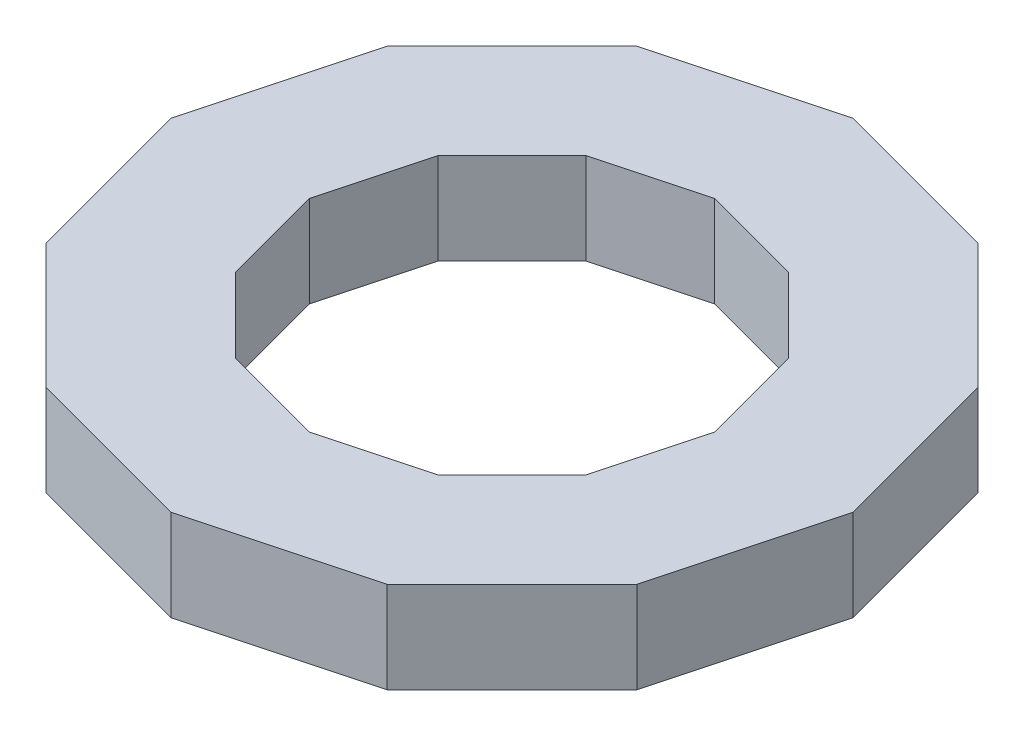
ISO-10303-21;
HEADER;
FILE_DESCRIPTION(('STEP AP214'),'2;1');
FILE_NAME('part.step','',(''),(''),'','','');
FILE_SCHEMA(('AUTOMOTIVE_DESIGN { 1 0 10303 214 1 1 1 1 }'));
ENDSEC;
DATA;
#1=APPLICATION_CONTEXT('core data for automotive mechanical design processes');
#2=APPLICATION_PROTOCOL_DEFINITION('international standard','automotive_design',2000,#1);
#3=PRODUCT_CONTEXT('',#1,'mechanical');
#4=PRODUCT('Part','Part','',(#3));
#5=PRODUCT_RELATED_PRODUCT_CATEGORY('part','',(#4));
#6=PRODUCT_DEFINITION_FORMATION('','',#4);
#7=PRODUCT_DEFINITION_CONTEXT('part definition',#1,'design');
#8=PRODUCT_DEFINITION('design','',#6,#7);
#9=PRODUCT_DEFINITION_SHAPE('','',#8);
#10=(LENGTH_UNIT() NAMED_UNIT(*) SI_UNIT(.MILLI.,.METRE.));
#11=(NAMED_UNIT(*) PLANE_ANGLE_UNIT() SI_UNIT($,.RADIAN.));
#12=(NAMED_UNIT(*) SI_UNIT($,.STERADIAN.) SOLID_ANGLE_UNIT());
#13=UNCERTAINTY_MEASURE_WITH_UNIT(LENGTH_MEASURE(1.E-05),#10,'distance_accuracy_value','');
#14=(GEOMETRIC_REPRESENTATION_CONTEXT(3) GLOBAL_UNCERTAINTY_ASSIGNED_CONTEXT((#13)) GLOBAL_UNIT_ASSIGNED_CONTEXT((#10,
#11,#12)) REPRESENTATION_CONTEXT('',''));
#15=CARTESIAN_POINT('',(0.,0.,0.));
#16=DIRECTION('',(0.,0.,1.));
#17=DIRECTION('',(1.,0.,0.));
#18=AXIS2_PLACEMENT_3D('',#15,#16,#17);
#19=CARTESIAN_POINT('',(0.,19.05,0.));
#20=DIRECTION('',(0.,1.,0.));
#21=DIRECTION('',(0.,0.,1.));
#22=AXIS2_PLACEMENT_3D('',#19,#20,#21);
#23=PLANE('',#22);
#24=DIRECTION('',(0.258819045102521,0.,-0.965925826289068));
#25=VECTOR('',#24,1.);
#26=CARTESIAN_POINT('',(61.6177909333269,19.05,35.5750481822264));
#27=LINE('',#26,#25);
#28=CARTESIAN_POINT('',(61.6177909333269,19.05,35.5750481822264));
#29=VERTEX_POINT('',#28);
#30=CARTESIAN_POINT('',(71.1500963644527,19.05,0.));
#31=VERTEX_POINT('',#30);
#32=EDGE_CURVE('E298',#29,#31,#27,.T.);
#33=ORIENTED_EDGE('',*,*,#32,.T.);
#34=DIRECTION('',(-0.258819045102521,0.,-0.965925826289068));
#35=VECTOR('',#34,1.);
#36=CARTESIAN_POINT('',(71.1500963644527,19.05,0.));
#37=LINE('',#36,#35);
#38=CARTESIAN_POINT('',(61.6177909333269,19.05,-35.5750481822263));
#39=VERTEX_POINT('',#38);
#40=EDGE_CURVE('E302',#31,#39,#37,.T.);
#41=ORIENTED_EDGE('',*,*,#40,.T.);
#42=DIRECTION('',(-0.707106781186548,0.,-0.707106781186547));
#43=VECTOR('',#42,1.);
#44=CARTESIAN_POINT('',(61.6177909333269,19.05,-35.5750481822263));
#45=LINE('',#44,#43);
#46=CARTESIAN_POINT('',(35.5750481822263,19.05,-61.6177909333269));
#47=VERTEX_POINT('',#46);
#48=EDGE_CURVE('E306',#39,#47,#45,.T.);
#49=ORIENTED_EDGE('',*,*,#48,.T.);
#50=DIRECTION('',(-0.965925826289068,0.,-0.258819045102521));
#51=VECTOR('',#50,1.);
#52=CARTESIAN_POINT('',(35.5750481822263,19.05,-61.6177909333269));
#53=LINE('',#52,#51);
#54=CARTESIAN_POINT('',(0.,19.05,-71.1500963644527));
#55=VERTEX_POINT('',#54);
#56=EDGE_CURVE('E309',#47,#55,#53,.T.);
#57=ORIENTED_EDGE('',*,*,#56,.T.);
#58=DIRECTION('',(-0.965925826289068,0.,0.258819045102521));
#59=VECTOR('',#58,1.);
#60=CARTESIAN_POINT('',(0.,19.05,-71.1500963644527));
#61=LINE('',#60,#59);
#62=CARTESIAN_POINT('',(-35.5750481822263,19.05,-61.6177909333269));
#63=VERTEX_POINT('',#62);
#64=EDGE_CURVE('E311',#55,#63,#61,.T.);
#65=ORIENTED_EDGE('',*,*,#64,.T.);
#66=DIRECTION('',(-0.707106781186547,0.,0.707106781186547));
#67=VECTOR('',#66,1.);
#68=CARTESIAN_POINT('',(-35.5750481822263,19.05,-61.6177909333269));
#69=LINE('',#68,#67);
#70=CARTESIAN_POINT('',(-61.6177909333269,19.05,-35.5750481822263));
#71=VERTEX_POINT('',#70);
#72=EDGE_CURVE('E313',#63,#71,#69,.T.);
#73=ORIENTED_EDGE('',*,*,#72,.T.);
#74=DIRECTION('',(-0.258819045102521,0.,0.965925826289068));
#75=VECTOR('',#74,1.);
#76=CARTESIAN_POINT('',(-61.6177909333269,19.05,-35.5750481822263));
#77=LINE('',#76,#75);
#78=CARTESIAN_POINT('',(-71.1500963644527,19.05,0.));
#79=VERTEX_POINT('',#78);
#80=EDGE_CURVE('E315',#71,#79,#77,.T.);
#81=ORIENTED_EDGE('',*,*,#80,.T.);
#82=DIRECTION('',(0.258819045102521,0.,0.965925826289068));
#83=VECTOR('',#82,1.);
#84=CARTESIAN_POINT('',(-71.1500963644527,19.05,0.));
#85=LINE('',#84,#83);
#86=CARTESIAN_POINT('',(-61.6177909333269,19.05,35.5750481822264));
#87=VERTEX_POINT('',#86);
#88=EDGE_CURVE('E318',#79,#87,#85,.T.);
#89=ORIENTED_EDGE('',*,*,#88,.T.);
#90=DIRECTION('',(0.707106781186548,0.,0.707106781186548));
#91=VECTOR('',#90,1.);
#92=CARTESIAN_POINT('',(-61.6177909333269,19.05,35.5750481822264));
#93=LINE('',#92,#91);
#94=CARTESIAN_POINT('',(-35.5750481822264,19.05,61.6177909333269));
#95=VERTEX_POINT('',#94);
#96=EDGE_CURVE('E320',#87,#95,#93,.T.);
#97=ORIENTED_EDGE('',*,*,#96,.T.);
#98=DIRECTION('',(0.965925826289068,0.,0.258819045102521));
#99=VECTOR('',#98,1.);
#100=CARTESIAN_POINT('',(-35.5750481822264,19.05,61.6177909333269));
#101=LINE('',#100,#99);
#102=CARTESIAN_POINT('',(0.,19.05,71.1500963644527));
#103=VERTEX_POINT('',#102);
#104=EDGE_CURVE('E322',#95,#103,#101,.T.);
#105=ORIENTED_EDGE('',*,*,#104,.T.);
#106=DIRECTION('',(0.965925826289068,0.,-0.258819045102521));
#107=VECTOR('',#106,1.);
#108=CARTESIAN_POINT('',(0.,19.05,71.1500963644527));
#109=LINE('',#108,#107);
#110=CARTESIAN_POINT('',(35.5750481822263,19.05,61.6177909333269));
#111=VERTEX_POINT('',#110);
#112=EDGE_CURVE('E325',#103,#111,#109,.T.);
#113=ORIENTED_EDGE('',*,*,#112,.T.);
#114=DIRECTION('',(0.707106781186548,0.,-0.707106781186547));
#115=VECTOR('',#114,1.);
#116=CARTESIAN_POINT('',(35.5750481822263,19.05,61.6177909333269));
#117=LINE('',#116,#115);
#118=EDGE_CURVE('E328',#111,#29,#117,.T.);
#119=ORIENTED_EDGE('',*,*,#118,.T.);
#120=EDGE_LOOP('',(#33,#41,#49,#57,#65,#73,#81,#89,#97,#105,#113,#119));
#121=FACE_BOUND('',#120,.T.);
#122=DIRECTION('',(-0.258819045102521,0.,-0.965925826289068));
#123=VECTOR('',#122,1.);
#124=CARTESIAN_POINT('',(42.224479883795,19.05,0.));
#125=LINE('',#124,#123);
#126=CARTESIAN_POINT('',(42.224479883795,19.05,0.));
#127=VERTEX_POINT('',#126);
#128=CARTESIAN_POINT('',(36.5674722409515,19.05,-21.1122399418975));
#129=VERTEX_POINT('',#128);
#130=EDGE_CURVE('E205',#127,#129,#125,.T.);
#131=ORIENTED_EDGE('',*,*,#130,.F.);
#132=DIRECTION('',(0.258819045102521,0.,-0.965925826289068));
#133=VECTOR('',#132,1.);
#134=CARTESIAN_POINT('',(36.5674722409515,19.05,21.1122399418975));
#135=LINE('',#134,#133);
#136=CARTESIAN_POINT('',(36.5674722409515,19.05,21.1122399418975));
#137=VERTEX_POINT('',#136);
#138=EDGE_CURVE('E196',#137,#127,#135,.T.);
#139=ORIENTED_EDGE('',*,*,#138,.F.);
#140=DIRECTION('',(0.707106781186547,0.,-0.707106781186548));
#141=VECTOR('',#140,1.);
#142=CARTESIAN_POINT('',(21.1122399418975,19.05,36.5674722409515));
#143=LINE('',#142,#141);
#144=CARTESIAN_POINT('',(21.1122399418975,19.05,36.5674722409515));
#145=VERTEX_POINT('',#144);
#146=EDGE_CURVE('E240',#145,#137,#143,.T.);
#147=ORIENTED_EDGE('',*,*,#146,.F.);
#148=DIRECTION('',(0.965925826289068,0.,-0.258819045102521));
#149=VECTOR('',#148,1.);
#150=CARTESIAN_POINT('',(0.,19.05,42.224479883795));
#151=LINE('',#150,#149);
#152=CARTESIAN_POINT('',(0.,19.05,42.224479883795));
#153=VERTEX_POINT('',#152);
#154=EDGE_CURVE('E237',#153,#145,#151,.T.);
#155=ORIENTED_EDGE('',*,*,#154,.F.);
#156=DIRECTION('',(0.965925826289068,0.,0.258819045102521));
#157=VECTOR('',#156,1.);
#158=CARTESIAN_POINT('',(-21.1122399418975,19.05,36.5674722409515));
#159=LINE('',#158,#157);
#160=CARTESIAN_POINT('',(-21.1122399418975,19.05,36.5674722409515));
#161=VERTEX_POINT('',#160);
#162=EDGE_CURVE('E235',#161,#153,#159,.T.);
#163=ORIENTED_EDGE('',*,*,#162,.F.);
#164=DIRECTION('',(0.707106781186548,0.,0.707106781186547));
#165=VECTOR('',#164,1.);
#166=CARTESIAN_POINT('',(-36.5674722409515,19.05,21.1122399418975));
#167=LINE('',#166,#165);
#168=CARTESIAN_POINT('',(-36.5674722409515,19.05,21.1122399418975));
#169=VERTEX_POINT('',#168);
#170=EDGE_CURVE('E232',#169,#161,#167,.T.);
#171=ORIENTED_EDGE('',*,*,#170,.F.);
#172=DIRECTION('',(0.258819045102521,0.,0.965925826289068));
#173=VECTOR('',#172,1.);
#174=CARTESIAN_POINT('',(-42.224479883795,19.05,0.));
#175=LINE('',#174,#173);
#176=CARTESIAN_POINT('',(-42.224479883795,19.05,0.));
#177=VERTEX_POINT('',#176);
#178=EDGE_CURVE('E230',#177,#169,#175,.T.);
#179=ORIENTED_EDGE('',*,*,#178,.F.);
#180=DIRECTION('',(-0.258819045102521,0.,0.965925826289068));
#181=VECTOR('',#180,1.);
#182=CARTESIAN_POINT('',(-36.5674722409515,19.05,-21.1122399418975));
#183=LINE('',#182,#181);
#184=CARTESIAN_POINT('',(-36.5674722409515,19.05,-21.1122399418975));
#185=VERTEX_POINT('',#184);
#186=EDGE_CURVE('E228',#185,#177,#183,.T.);
#187=ORIENTED_EDGE('',*,*,#186,.F.);
#188=DIRECTION('',(-0.707106781186547,0.,0.707106781186548));
#189=VECTOR('',#188,1.);
#190=CARTESIAN_POINT('',(-21.1122399418975,19.05,-36.5674722409515));
#191=LINE('',#190,#189);
#192=CARTESIAN_POINT('',(-21.1122399418975,19.05,-36.5674722409515));
#193=VERTEX_POINT('',#192);
#194=EDGE_CURVE('E226',#193,#185,#191,.T.);
#195=ORIENTED_EDGE('',*,*,#194,.F.);
#196=DIRECTION('',(-0.965925826289068,0.,0.258819045102521));
#197=VECTOR('',#196,1.);
#198=CARTESIAN_POINT('',(0.,19.05,-42.224479883795));
#199=LINE('',#198,#197);
#200=CARTESIAN_POINT('',(0.,19.05,-42.224479883795));
#201=VERTEX_POINT('',#200);
#202=EDGE_CURVE('E224',#201,#193,#199,.T.);
#203=ORIENTED_EDGE('',*,*,#202,.F.);
#204=DIRECTION('',(-0.965925826289068,0.,-0.258819045102521));
#205=VECTOR('',#204,1.);
#206=CARTESIAN_POINT('',(21.1122399418974,19.05,-36.5674722409515));
#207=LINE('',#206,#205);
#208=CARTESIAN_POINT('',(21.1122399418974,19.05,-36.5674722409515));
#209=VERTEX_POINT('',#208);
#210=EDGE_CURVE('E220',#209,#201,#207,.T.);
#211=ORIENTED_EDGE('',*,*,#210,.F.);
#212=DIRECTION('',(-0.707106781186548,0.,-0.707106781186547));
#213=VECTOR('',#212,1.);
#214=CARTESIAN_POINT('',(36.5674722409515,19.05,-21.1122399418975));
#215=LINE('',#214,#213);
#216=EDGE_CURVE('E218',#129,#209,#215,.T.);
#217=ORIENTED_EDGE('',*,*,#216,.F.);
#218=EDGE_LOOP('',(#131,#139,#147,#155,#163,#171,#179,#187,#195,#203,#211,#217));
#219=FACE_BOUND('',#218,.T.);
#220=ADVANCED_FACE('F35',(#121,#219),#23,.T.);
#221=CARTESIAN_POINT('',(0.,0.,0.));
#222=DIRECTION('',(0.,1.,0.));
#223=DIRECTION('',(0.,0.,1.));
#224=AXIS2_PLACEMENT_3D('',#221,#222,#223);
#225=PLANE('',#224);
#226=DIRECTION('',(0.258819045102521,0.,-0.965925826289068));
#227=VECTOR('',#226,1.);
#228=CARTESIAN_POINT('',(61.6177909333269,0.,35.5750481822264));
#229=LINE('',#228,#227);
#230=CARTESIAN_POINT('',(61.6177909333269,0.,35.5750481822264));
#231=VERTEX_POINT('',#230);
#232=CARTESIAN_POINT('',(71.1500963644527,0.,0.));
#233=VERTEX_POINT('',#232);
#234=EDGE_CURVE('E213',#231,#233,#229,.T.);
#235=ORIENTED_EDGE('',*,*,#234,.F.);
#236=DIRECTION('',(0.707106781186548,0.,-0.707106781186547));
#237=VECTOR('',#236,1.);
#238=CARTESIAN_POINT('',(35.5750481822263,0.,61.6177909333269));
#239=LINE('',#238,#237);
#240=CARTESIAN_POINT('',(35.5750481822263,0.,61.6177909333269));
#241=VERTEX_POINT('',#240);
#242=EDGE_CURVE('E303',#241,#231,#239,.T.);
#243=ORIENTED_EDGE('',*,*,#242,.F.);
#244=DIRECTION('',(0.965925826289068,0.,-0.258819045102521));
#245=VECTOR('',#244,1.);
#246=CARTESIAN_POINT('',(0.,0.,71.1500963644527));
#247=LINE('',#246,#245);
#248=CARTESIAN_POINT('',(0.,0.,71.1500963644527));
#249=VERTEX_POINT('',#248);
#250=EDGE_CURVE('E356',#249,#241,#247,.T.);
#251=ORIENTED_EDGE('',*,*,#250,.F.);
#252=DIRECTION('',(0.965925826289068,0.,0.258819045102521));
#253=VECTOR('',#252,1.);
#254=CARTESIAN_POINT('',(-35.5750481822264,0.,61.6177909333269));
#255=LINE('',#254,#253);
#256=CARTESIAN_POINT('',(-35.5750481822264,0.,61.6177909333269));
#257=VERTEX_POINT('',#256);
#258=EDGE_CURVE('E353',#257,#249,#255,.T.);
#259=ORIENTED_EDGE('',*,*,#258,.F.);
#260=DIRECTION('',(0.707106781186548,0.,0.707106781186548));
#261=VECTOR('',#260,1.);
#262=CARTESIAN_POINT('',(-61.6177909333269,0.,35.5750481822264));
#263=LINE('',#262,#261);
#264=CARTESIAN_POINT('',(-61.6177909333269,0.,35.5750481822264));
#265=VERTEX_POINT('',#264);
#266=EDGE_CURVE('E351',#265,#257,#263,.T.);
#267=ORIENTED_EDGE('',*,*,#266,.F.);
#268=DIRECTION('',(0.258819045102521,0.,0.965925826289068));
#269=VECTOR('',#268,1.);
#270=CARTESIAN_POINT('',(-71.1500963644527,0.,0.));
#271=LINE('',#270,#269);
#272=CARTESIAN_POINT('',(-71.1500963644527,0.,0.));
#273=VERTEX_POINT('',#272);
#274=EDGE_CURVE('E349',#273,#265,#271,.T.);
#275=ORIENTED_EDGE('',*,*,#274,.F.);
#276=DIRECTION('',(-0.258819045102521,0.,0.965925826289068));
#277=VECTOR('',#276,1.);
#278=CARTESIAN_POINT('',(-61.6177909333269,0.,-35.5750481822263));
#279=LINE('',#278,#277);
#280=CARTESIAN_POINT('',(-61.6177909333269,0.,-35.5750481822263));
#281=VERTEX_POINT('',#280);
#282=EDGE_CURVE('E346',#281,#273,#279,.T.);
#283=ORIENTED_EDGE('',*,*,#282,.F.);
#284=DIRECTION('',(-0.707106781186547,0.,0.707106781186547));
#285=VECTOR('',#284,1.);
#286=CARTESIAN_POINT('',(-35.5750481822263,0.,-61.6177909333269));
#287=LINE('',#286,#285);
#288=CARTESIAN_POINT('',(-35.5750481822263,0.,-61.6177909333269));
#289=VERTEX_POINT('',#288);
#290=EDGE_CURVE('E344',#289,#281,#287,.T.);
#291=ORIENTED_EDGE('',*,*,#290,.F.);
#292=DIRECTION('',(-0.965925826289068,0.,0.258819045102521));
#293=VECTOR('',#292,1.);
#294=CARTESIAN_POINT('',(0.,0.,-71.1500963644527));
#295=LINE('',#294,#293);
#296=CARTESIAN_POINT('',(0.,0.,-71.1500963644527));
#297=VERTEX_POINT('',#296);
#298=EDGE_CURVE('E342',#297,#289,#295,.T.);
#299=ORIENTED_EDGE('',*,*,#298,.F.);
#300=DIRECTION('',(-0.965925826289068,0.,-0.258819045102521));
#301=VECTOR('',#300,1.);
#302=CARTESIAN_POINT('',(35.5750481822263,0.,-61.6177909333269));
#303=LINE('',#302,#301);
#304=CARTESIAN_POINT('',(35.5750481822263,0.,-61.6177909333269));
#305=VERTEX_POINT('',#304);
#306=EDGE_CURVE('E339',#305,#297,#303,.T.);
#307=ORIENTED_EDGE('',*,*,#306,.F.);
#308=DIRECTION('',(-0.707106781186548,0.,-0.707106781186547));
#309=VECTOR('',#308,1.);
#310=CARTESIAN_POINT('',(61.6177909333269,0.,-35.5750481822263));
#311=LINE('',#310,#309);
#312=CARTESIAN_POINT('',(61.6177909333269,0.,-35.5750481822263));
#313=VERTEX_POINT('',#312);
#314=EDGE_CURVE('E337',#313,#305,#311,.T.);
#315=ORIENTED_EDGE('',*,*,#314,.F.);
#316=DIRECTION('',(-0.258819045102521,0.,-0.965925826289068));
#317=VECTOR('',#316,1.);
#318=CARTESIAN_POINT('',(71.1500963644527,0.,0.));
#319=LINE('',#318,#317);
#320=EDGE_CURVE('E334',#233,#313,#319,.T.);
#321=ORIENTED_EDGE('',*,*,#320,.F.);
#322=EDGE_LOOP('',(#235,#243,#251,#259,#267,#275,#283,#291,#299,#307,#315,#321));
#323=FACE_BOUND('',#322,.T.);
#324=DIRECTION('',(0.258819045102521,0.,-0.965925826289068));
#325=VECTOR('',#324,1.);
#326=CARTESIAN_POINT('',(36.5674722409515,0.,21.1122399418975));
#327=LINE('',#326,#325);
#328=CARTESIAN_POINT('',(36.5674722409515,0.,21.1122399418975));
#329=VERTEX_POINT('',#328);
#330=CARTESIAN_POINT('',(42.224479883795,0.,0.));
#331=VERTEX_POINT('',#330);
#332=EDGE_CURVE('E58',#329,#331,#327,.T.);
#333=ORIENTED_EDGE('',*,*,#332,.T.);
#334=DIRECTION('',(-0.258819045102521,0.,-0.965925826289068));
#335=VECTOR('',#334,1.);
#336=CARTESIAN_POINT('',(42.224479883795,0.,0.));
#337=LINE('',#336,#335);
#338=CARTESIAN_POINT('',(36.5674722409515,0.,-21.1122399418975));
#339=VERTEX_POINT('',#338);
#340=EDGE_CURVE('E212',#331,#339,#337,.T.);
#341=ORIENTED_EDGE('',*,*,#340,.T.);
#342=DIRECTION('',(-0.707106781186548,0.,-0.707106781186547));
#343=VECTOR('',#342,1.);
#344=CARTESIAN_POINT('',(36.5674722409515,0.,-21.1122399418975));
#345=LINE('',#344,#343);
#346=CARTESIAN_POINT('',(21.1122399418974,0.,-36.5674722409515));
#347=VERTEX_POINT('',#346);
#348=EDGE_CURVE('E245',#339,#347,#345,.T.);
#349=ORIENTED_EDGE('',*,*,#348,.T.);
#350=DIRECTION('',(-0.965925826289068,0.,-0.258819045102521));
#351=VECTOR('',#350,1.);
#352=CARTESIAN_POINT('',(21.1122399418974,0.,-36.5674722409515));
#353=LINE('',#352,#351);
#354=CARTESIAN_POINT('',(0.,0.,-42.224479883795));
#355=VERTEX_POINT('',#354);
#356=EDGE_CURVE('E248',#347,#355,#353,.T.);
#357=ORIENTED_EDGE('',*,*,#356,.T.);
#358=DIRECTION('',(-0.965925826289068,0.,0.258819045102521));
#359=VECTOR('',#358,1.);
#360=CARTESIAN_POINT('',(0.,0.,-42.224479883795));
#361=LINE('',#360,#359);
#362=CARTESIAN_POINT('',(-21.1122399418975,0.,-36.5674722409515));
#363=VERTEX_POINT('',#362);
#364=EDGE_CURVE('E251',#355,#363,#361,.T.);
#365=ORIENTED_EDGE('',*,*,#364,.T.);
#366=DIRECTION('',(-0.707106781186547,0.,0.707106781186548));
#367=VECTOR('',#366,1.);
#368=CARTESIAN_POINT('',(-21.1122399418975,0.,-36.5674722409515));
#369=LINE('',#368,#367);
#370=CARTESIAN_POINT('',(-36.5674722409515,0.,-21.1122399418975));
#371=VERTEX_POINT('',#370);
#372=EDGE_CURVE('E254',#363,#371,#369,.T.);
#373=ORIENTED_EDGE('',*,*,#372,.T.);
#374=DIRECTION('',(-0.258819045102521,0.,0.965925826289068));
#375=VECTOR('',#374,1.);
#376=CARTESIAN_POINT('',(-36.5674722409515,0.,-21.1122399418975));
#377=LINE('',#376,#375);
#378=CARTESIAN_POINT('',(-42.224479883795,0.,0.));
#379=VERTEX_POINT('',#378);
#380=EDGE_CURVE('E257',#371,#379,#377,.T.);
#381=ORIENTED_EDGE('',*,*,#380,.T.);
#382=DIRECTION('',(0.258819045102521,0.,0.965925826289068));
#383=VECTOR('',#382,1.);
#384=CARTESIAN_POINT('',(-42.224479883795,0.,0.));
#385=LINE('',#384,#383);
#386=CARTESIAN_POINT('',(-36.5674722409515,0.,21.1122399418975));
#387=VERTEX_POINT('',#386);
#388=EDGE_CURVE('E261',#379,#387,#385,.T.);
#389=ORIENTED_EDGE('',*,*,#388,.T.);
#390=DIRECTION('',(0.707106781186548,0.,0.707106781186547));
#391=VECTOR('',#390,1.);
#392=CARTESIAN_POINT('',(-36.5674722409515,0.,21.1122399418975));
#393=LINE('',#392,#391);
#394=CARTESIAN_POINT('',(-21.1122399418975,0.,36.5674722409515));
#395=VERTEX_POINT('',#394);
#396=EDGE_CURVE('E264',#387,#395,#393,.T.);
#397=ORIENTED_EDGE('',*,*,#396,.T.);
#398=DIRECTION('',(0.965925826289068,0.,0.258819045102521));
#399=VECTOR('',#398,1.);
#400=CARTESIAN_POINT('',(-21.1122399418975,0.,36.5674722409515));
#401=LINE('',#400,#399);
#402=CARTESIAN_POINT('',(0.,0.,42.224479883795));
#403=VERTEX_POINT('',#402);
#404=EDGE_CURVE('E267',#395,#403,#401,.T.);
#405=ORIENTED_EDGE('',*,*,#404,.T.);
#406=DIRECTION('',(0.965925826289068,0.,-0.258819045102521));
#407=VECTOR('',#406,1.);
#408=CARTESIAN_POINT('',(0.,0.,42.224479883795));
#409=LINE('',#408,#407);
#410=CARTESIAN_POINT('',(21.1122399418975,0.,36.5674722409515));
#411=VERTEX_POINT('',#410);
#412=EDGE_CURVE('E270',#403,#411,#409,.T.);
#413=ORIENTED_EDGE('',*,*,#412,.T.);
#414=DIRECTION('',(0.707106781186547,0.,-0.707106781186548));
#415=VECTOR('',#414,1.);
#416=CARTESIAN_POINT('',(21.1122399418975,0.,36.5674722409515));
#417=LINE('',#416,#415);
#418=EDGE_CURVE('E206',#411,#329,#417,.T.);
#419=ORIENTED_EDGE('',*,*,#418,.T.);
#420=EDGE_LOOP('',(#333,#341,#349,#357,#365,#373,#381,#389,#397,#405,#413,#419));
#421=FACE_BOUND('',#420,.T.);
#422=ADVANCED_FACE('F402',(#323,#421),#225,.F.);
#423=CARTESIAN_POINT('',(61.6177909333269,19.05,35.5750481822264));
#424=DIRECTION('',(-0.965925826289068,0.,-0.258819045102521));
#425=DIRECTION('',(-0.258819045102521,0.,0.965925826289068));
#426=AXIS2_PLACEMENT_3D('',#423,#424,#425);
#427=PLANE('',#426);
#428=ORIENTED_EDGE('',*,*,#234,.T.);
#429=DIRECTION('',(0.,-1.,0.));
#430=VECTOR('',#429,1.);
#431=CARTESIAN_POINT('',(71.1500963644527,19.05,0.));
#432=LINE('',#431,#430);
#433=EDGE_CURVE('E11',#31,#233,#432,.T.);
#434=ORIENTED_EDGE('',*,*,#433,.F.);
#435=ORIENTED_EDGE('',*,*,#32,.F.);
#436=DIRECTION('',(0.,-1.,0.));
#437=VECTOR('',#436,1.);
#438=CARTESIAN_POINT('',(61.6177909333269,19.05,35.5750481822264));
#439=LINE('',#438,#437);
#440=EDGE_CURVE('E330',#29,#231,#439,.T.);
#441=ORIENTED_EDGE('',*,*,#440,.T.);
#442=EDGE_LOOP('',(#428,#434,#435,#441));
#443=FACE_BOUND('',#442,.T.);
#444=ADVANCED_FACE('F37',(#443),#427,.F.);
#445=CARTESIAN_POINT('',(71.1500963644527,19.05,0.));
#446=DIRECTION('',(-0.965925826289068,0.,0.258819045102521));
#447=DIRECTION('',(0.258819045102521,0.,0.965925826289068));
#448=AXIS2_PLACEMENT_3D('',#445,#446,#447);
#449=PLANE('',#448);
#450=ORIENTED_EDGE('',*,*,#320,.T.);
#451=DIRECTION('',(0.,-1.,0.));
#452=VECTOR('',#451,1.);
#453=CARTESIAN_POINT('',(61.6177909333269,19.05,-35.5750481822263));
#454=LINE('',#453,#452);
#455=EDGE_CURVE('E43',#39,#313,#454,.T.);
#456=ORIENTED_EDGE('',*,*,#455,.F.);
#457=ORIENTED_EDGE('',*,*,#40,.F.);
#458=ORIENTED_EDGE('',*,*,#433,.T.);
#459=EDGE_LOOP('',(#450,#456,#457,#458));
#460=FACE_BOUND('',#459,.T.);
#461=ADVANCED_FACE('F419',(#460),#449,.F.);
#462=CARTESIAN_POINT('',(61.6177909333269,19.05,-35.5750481822263));
#463=DIRECTION('',(-0.707106781186547,0.,0.707106781186548));
#464=DIRECTION('',(0.707106781186548,0.,0.707106781186547));
#465=AXIS2_PLACEMENT_3D('',#462,#463,#464);
#466=PLANE('',#465);
#467=ORIENTED_EDGE('',*,*,#314,.T.);
#468=DIRECTION('',(0.,-1.,0.));
#469=VECTOR('',#468,1.);
#470=CARTESIAN_POINT('',(35.5750481822263,19.05,-61.6177909333269));
#471=LINE('',#470,#469);
#472=EDGE_CURVE('E389',#47,#305,#471,.T.);
#473=ORIENTED_EDGE('',*,*,#472,.F.);
#474=ORIENTED_EDGE('',*,*,#48,.F.);
#475=ORIENTED_EDGE('',*,*,#455,.T.);
#476=EDGE_LOOP('',(#467,#473,#474,#475));
#477=FACE_BOUND('',#476,.T.);
#478=ADVANCED_FACE('F396',(#477),#466,.F.);
#479=CARTESIAN_POINT('',(35.5750481822263,19.05,-61.6177909333269));
#480=DIRECTION('',(-0.258819045102521,0.,0.965925826289068));
#481=DIRECTION('',(0.965925826289068,0.,0.258819045102521));
#482=AXIS2_PLACEMENT_3D('',#479,#480,#481);
#483=PLANE('',#482);
#484=ORIENTED_EDGE('',*,*,#306,.T.);
#485=DIRECTION('',(0.,-1.,0.));
#486=VECTOR('',#485,1.);
#487=CARTESIAN_POINT('',(0.,19.05,-71.1500963644527));
#488=LINE('',#487,#486);
#489=EDGE_CURVE('E386',#55,#297,#488,.T.);
#490=ORIENTED_EDGE('',*,*,#489,.F.);
#491=ORIENTED_EDGE('',*,*,#56,.F.);
#492=ORIENTED_EDGE('',*,*,#472,.T.);
#493=EDGE_LOOP('',(#484,#490,#491,#492));
#494=FACE_BOUND('',#493,.T.);
#495=ADVANCED_FACE('F408',(#494),#483,.F.);
#496=CARTESIAN_POINT('',(0.,19.05,-71.1500963644527));
#497=DIRECTION('',(0.258819045102521,0.,0.965925826289068));
#498=DIRECTION('',(0.965925826289068,0.,-0.258819045102521));
#499=AXIS2_PLACEMENT_3D('',#496,#497,#498);
#500=PLANE('',#499);
#501=ORIENTED_EDGE('',*,*,#298,.T.);
#502=DIRECTION('',(0.,-1.,0.));
#503=VECTOR('',#502,1.);
#504=CARTESIAN_POINT('',(-35.5750481822263,19.05,-61.6177909333269));
#505=LINE('',#504,#503);
#506=EDGE_CURVE('E382',#63,#289,#505,.T.);
#507=ORIENTED_EDGE('',*,*,#506,.F.);
#508=ORIENTED_EDGE('',*,*,#64,.F.);
#509=ORIENTED_EDGE('',*,*,#489,.T.);
#510=EDGE_LOOP('',(#501,#507,#508,#509));
#511=FACE_BOUND('',#510,.T.);
#512=ADVANCED_FACE('F412',(#511),#500,.F.);
#513=CARTESIAN_POINT('',(-35.5750481822263,19.05,-61.6177909333269));
#514=DIRECTION('',(0.707106781186547,0.,0.707106781186547));
#515=DIRECTION('',(0.707106781186548,0.,-0.707106781186548));
#516=AXIS2_PLACEMENT_3D('',#513,#514,#515);
#517=PLANE('',#516);
#518=ORIENTED_EDGE('',*,*,#290,.T.);
#519=DIRECTION('',(0.,-1.,0.));
#520=VECTOR('',#519,1.);
#521=CARTESIAN_POINT('',(-61.6177909333269,19.05,-35.5750481822263));
#522=LINE('',#521,#520);
#523=EDGE_CURVE('E379',#71,#281,#522,.T.);
#524=ORIENTED_EDGE('',*,*,#523,.F.);
#525=ORIENTED_EDGE('',*,*,#72,.F.);
#526=ORIENTED_EDGE('',*,*,#506,.T.);
#527=EDGE_LOOP('',(#518,#524,#525,#526));
#528=FACE_BOUND('',#527,.T.);
#529=ADVANCED_FACE('F452',(#528),#517,.F.);
#530=CARTESIAN_POINT('',(-61.6177909333269,19.05,-35.5750481822263));
#531=DIRECTION('',(0.965925826289068,0.,0.258819045102521));
#532=DIRECTION('',(0.258819045102521,0.,-0.965925826289068));
#533=AXIS2_PLACEMENT_3D('',#530,#531,#532);
#534=PLANE('',#533);
#535=ORIENTED_EDGE('',*,*,#282,.T.);
#536=DIRECTION('',(0.,-1.,0.));
#537=VECTOR('',#536,1.);
#538=CARTESIAN_POINT('',(-71.1500963644527,19.05,0.));
#539=LINE('',#538,#537);
#540=EDGE_CURVE('E375',#79,#273,#539,.T.);
#541=ORIENTED_EDGE('',*,*,#540,.F.);
#542=ORIENTED_EDGE('',*,*,#80,.F.);
#543=ORIENTED_EDGE('',*,*,#523,.T.);
#544=EDGE_LOOP('',(#535,#541,#542,#543));
#545=FACE_BOUND('',#544,.T.);
#546=ADVANCED_FACE('F450',(#545),#534,.F.);
#547=CARTESIAN_POINT('',(-71.1500963644527,19.05,0.));
#548=DIRECTION('',(0.965925826289068,0.,-0.258819045102521));
#549=DIRECTION('',(-0.258819045102521,0.,-0.965925826289068));
#550=AXIS2_PLACEMENT_3D('',#547,#548,#549);
#551=PLANE('',#550);
#552=ORIENTED_EDGE('',*,*,#274,.T.);
#553=DIRECTION('',(0.,-1.,0.));
#554=VECTOR('',#553,1.);
#555=CARTESIAN_POINT('',(-61.6177909333269,19.05,35.5750481822264));
#556=LINE('',#555,#554);
#557=EDGE_CURVE('E372',#87,#265,#556,.T.);
#558=ORIENTED_EDGE('',*,*,#557,.F.);
#559=ORIENTED_EDGE('',*,*,#88,.F.);
#560=ORIENTED_EDGE('',*,*,#540,.T.);
#561=EDGE_LOOP('',(#552,#558,#559,#560));
#562=FACE_BOUND('',#561,.T.);
#563=ADVANCED_FACE('F446',(#562),#551,.F.);
#564=CARTESIAN_POINT('',(-61.6177909333269,19.05,35.5750481822264));
#565=DIRECTION('',(0.707106781186548,0.,-0.707106781186548));
#566=DIRECTION('',(-0.707106781186548,0.,-0.707106781186548));
#567=AXIS2_PLACEMENT_3D('',#564,#565,#566);
#568=PLANE('',#567);
#569=ORIENTED_EDGE('',*,*,#266,.T.);
#570=DIRECTION('',(0.,-1.,0.));
#571=VECTOR('',#570,1.);
#572=CARTESIAN_POINT('',(-35.5750481822264,19.05,61.6177909333269));
#573=LINE('',#572,#571);
#574=EDGE_CURVE('E368',#95,#257,#573,.T.);
#575=ORIENTED_EDGE('',*,*,#574,.F.);
#576=ORIENTED_EDGE('',*,*,#96,.F.);
#577=ORIENTED_EDGE('',*,*,#557,.T.);
#578=EDGE_LOOP('',(#569,#575,#576,#577));
#579=FACE_BOUND('',#578,.T.);
#580=ADVANCED_FACE('F441',(#579),#568,.F.);
#581=CARTESIAN_POINT('',(-35.5750481822264,19.05,61.6177909333269));
#582=DIRECTION('',(0.258819045102521,0.,-0.965925826289068));
#583=DIRECTION('',(-0.965925826289068,0.,-0.258819045102521));
#584=AXIS2_PLACEMENT_3D('',#581,#582,#583);
#585=PLANE('',#584);
#586=ORIENTED_EDGE('',*,*,#258,.T.);
#587=DIRECTION('',(0.,-1.,0.));
#588=VECTOR('',#587,1.);
#589=CARTESIAN_POINT('',(0.,19.05,71.1500963644527));
#590=LINE('',#589,#588);
#591=EDGE_CURVE('E365',#103,#249,#590,.T.);
#592=ORIENTED_EDGE('',*,*,#591,.F.);
#593=ORIENTED_EDGE('',*,*,#104,.F.);
#594=ORIENTED_EDGE('',*,*,#574,.T.);
#595=EDGE_LOOP('',(#586,#592,#593,#594));
#596=FACE_BOUND('',#595,.T.);
#597=ADVANCED_FACE('F435',(#596),#585,.F.);
#598=CARTESIAN_POINT('',(0.,19.05,71.1500963644527));
#599=DIRECTION('',(-0.258819045102521,0.,-0.965925826289068));
#600=DIRECTION('',(-0.965925826289068,0.,0.258819045102521));
#601=AXIS2_PLACEMENT_3D('',#598,#599,#600);
#602=PLANE('',#601);
#603=ORIENTED_EDGE('',*,*,#250,.T.);
#604=DIRECTION('',(0.,-1.,0.));
#605=VECTOR('',#604,1.);
#606=CARTESIAN_POINT('',(35.5750481822263,19.05,61.6177909333269));
#607=LINE('',#606,#605);
#608=EDGE_CURVE('E362',#111,#241,#607,.T.);
#609=ORIENTED_EDGE('',*,*,#608,.F.);
#610=ORIENTED_EDGE('',*,*,#112,.F.);
#611=ORIENTED_EDGE('',*,*,#591,.T.);
#612=EDGE_LOOP('',(#603,#609,#610,#611));
#613=FACE_BOUND('',#612,.T.);
#614=ADVANCED_FACE('F431',(#613),#602,.F.);
#615=CARTESIAN_POINT('',(35.5750481822263,19.05,61.6177909333269));
#616=DIRECTION('',(-0.707106781186547,0.,-0.707106781186548));
#617=DIRECTION('',(-0.707106781186548,0.,0.707106781186547));
#618=AXIS2_PLACEMENT_3D('',#615,#616,#617);
#619=PLANE('',#618);
#620=ORIENTED_EDGE('',*,*,#242,.T.);
#621=ORIENTED_EDGE('',*,*,#440,.F.);
#622=ORIENTED_EDGE('',*,*,#118,.F.);
#623=ORIENTED_EDGE('',*,*,#608,.T.);
#624=EDGE_LOOP('',(#620,#621,#622,#623));
#625=FACE_BOUND('',#624,.T.);
#626=ADVANCED_FACE('F426',(#625),#619,.F.);
#627=CARTESIAN_POINT('',(36.5674722409515,19.05,21.1122399418975));
#628=DIRECTION('',(-0.965925826289068,0.,-0.258819045102521));
#629=DIRECTION('',(-0.258819045102521,0.,0.965925826289068));
#630=AXIS2_PLACEMENT_3D('',#627,#628,#629);
#631=PLANE('',#630);
#632=ORIENTED_EDGE('',*,*,#332,.F.);
#633=DIRECTION('',(0.,-1.,0.));
#634=VECTOR('',#633,1.);
#635=CARTESIAN_POINT('',(36.5674722409515,19.05,21.1122399418975));
#636=LINE('',#635,#634);
#637=EDGE_CURVE('E200',#137,#329,#636,.T.);
#638=ORIENTED_EDGE('',*,*,#637,.F.);
#639=ORIENTED_EDGE('',*,*,#138,.T.);
#640=DIRECTION('',(0.,-1.,0.));
#641=VECTOR('',#640,1.);
#642=CARTESIAN_POINT('',(42.224479883795,19.05,0.));
#643=LINE('',#642,#641);
#644=EDGE_CURVE('E199',#127,#331,#643,.T.);
#645=ORIENTED_EDGE('',*,*,#644,.T.);
#646=EDGE_LOOP('',(#632,#638,#639,#645));
#647=FACE_BOUND('',#646,.T.);
#648=ADVANCED_FACE('F198',(#647),#631,.T.);
#649=CARTESIAN_POINT('',(42.224479883795,19.05,0.));
#650=DIRECTION('',(-0.965925826289068,0.,0.258819045102521));
#651=DIRECTION('',(0.258819045102521,0.,0.965925826289068));
#652=AXIS2_PLACEMENT_3D('',#649,#650,#651);
#653=PLANE('',#652);
#654=ORIENTED_EDGE('',*,*,#340,.F.);
#655=ORIENTED_EDGE('',*,*,#644,.F.);
#656=ORIENTED_EDGE('',*,*,#130,.T.);
#657=DIRECTION('',(0.,-1.,0.));
#658=VECTOR('',#657,1.);
#659=CARTESIAN_POINT('',(36.5674722409515,19.05,-21.1122399418975));
#660=LINE('',#659,#658);
#661=EDGE_CURVE('E214',#129,#339,#660,.T.);
#662=ORIENTED_EDGE('',*,*,#661,.T.);
#663=EDGE_LOOP('',(#654,#655,#656,#662));
#664=FACE_BOUND('',#663,.T.);
#665=ADVANCED_FACE('F209',(#664),#653,.T.);
#666=CARTESIAN_POINT('',(36.5674722409515,19.05,-21.1122399418975));
#667=DIRECTION('',(-0.707106781186547,0.,0.707106781186548));
#668=DIRECTION('',(0.707106781186548,0.,0.707106781186547));
#669=AXIS2_PLACEMENT_3D('',#666,#667,#668);
#670=PLANE('',#669);
#671=ORIENTED_EDGE('',*,*,#348,.F.);
#672=ORIENTED_EDGE('',*,*,#661,.F.);
#673=ORIENTED_EDGE('',*,*,#216,.T.);
#674=DIRECTION('',(0.,-1.,0.));
#675=VECTOR('',#674,1.);
#676=CARTESIAN_POINT('',(21.1122399418974,19.05,-36.5674722409515));
#677=LINE('',#676,#675);
#678=EDGE_CURVE('E295',#209,#347,#677,.T.);
#679=ORIENTED_EDGE('',*,*,#678,.T.);
#680=EDGE_LOOP('',(#671,#672,#673,#679));
#681=FACE_BOUND('',#680,.T.);
#682=ADVANCED_FACE('F510',(#681),#670,.T.);
#683=CARTESIAN_POINT('',(21.1122399418974,19.05,-36.5674722409515));
#684=DIRECTION('',(-0.258819045102521,0.,0.965925826289068));
#685=DIRECTION('',(0.965925826289068,0.,0.258819045102521));
#686=AXIS2_PLACEMENT_3D('',#683,#684,#685);
#687=PLANE('',#686);
#688=ORIENTED_EDGE('',*,*,#356,.F.);
#689=ORIENTED_EDGE('',*,*,#678,.F.);
#690=ORIENTED_EDGE('',*,*,#210,.T.);
#691=DIRECTION('',(0.,-1.,0.));
#692=VECTOR('',#691,1.);
#693=CARTESIAN_POINT('',(0.,19.05,-42.224479883795));
#694=LINE('',#693,#692);
#695=EDGE_CURVE('E292',#201,#355,#694,.T.);
#696=ORIENTED_EDGE('',*,*,#695,.T.);
#697=EDGE_LOOP('',(#688,#689,#690,#696));
#698=FACE_BOUND('',#697,.T.);
#699=ADVANCED_FACE('F516',(#698),#687,.T.);
#700=CARTESIAN_POINT('',(0.,19.05,-42.224479883795));
#701=DIRECTION('',(0.258819045102521,0.,0.965925826289068));
#702=DIRECTION('',(0.965925826289068,0.,-0.258819045102521));
#703=AXIS2_PLACEMENT_3D('',#700,#701,#702);
#704=PLANE('',#703);
#705=ORIENTED_EDGE('',*,*,#364,.F.);
#706=ORIENTED_EDGE('',*,*,#695,.F.);
#707=ORIENTED_EDGE('',*,*,#202,.T.);
#708=DIRECTION('',(0.,-1.,0.));
#709=VECTOR('',#708,1.);
#710=CARTESIAN_POINT('',(-21.1122399418975,19.05,-36.5674722409515));
#711=LINE('',#710,#709);
#712=EDGE_CURVE('E290',#193,#363,#711,.T.);
#713=ORIENTED_EDGE('',*,*,#712,.T.);
#714=EDGE_LOOP('',(#705,#706,#707,#713));
#715=FACE_BOUND('',#714,.T.);
#716=ADVANCED_FACE('F524',(#715),#704,.T.);
#717=CARTESIAN_POINT('',(-21.1122399418975,19.05,-36.5674722409515));
#718=DIRECTION('',(0.707106781186548,0.,0.707106781186547));
#719=DIRECTION('',(0.707106781186547,0.,-0.707106781186548));
#720=AXIS2_PLACEMENT_3D('',#717,#718,#719);
#721=PLANE('',#720);
#722=ORIENTED_EDGE('',*,*,#372,.F.);
#723=ORIENTED_EDGE('',*,*,#712,.F.);
#724=ORIENTED_EDGE('',*,*,#194,.T.);
#725=DIRECTION('',(0.,-1.,0.));
#726=VECTOR('',#725,1.);
#727=CARTESIAN_POINT('',(-36.5674722409515,19.05,-21.1122399418975));
#728=LINE('',#727,#726);
#729=EDGE_CURVE('E288',#185,#371,#728,.T.);
#730=ORIENTED_EDGE('',*,*,#729,.T.);
#731=EDGE_LOOP('',(#722,#723,#724,#730));
#732=FACE_BOUND('',#731,.T.);
#733=ADVANCED_FACE('F532',(#732),#721,.T.);
#734=CARTESIAN_POINT('',(-36.5674722409515,19.05,-21.1122399418975));
#735=DIRECTION('',(0.965925826289068,0.,0.258819045102521));
#736=DIRECTION('',(0.258819045102521,0.,-0.965925826289068));
#737=AXIS2_PLACEMENT_3D('',#734,#735,#736);
#738=PLANE('',#737);
#739=ORIENTED_EDGE('',*,*,#380,.F.);
#740=ORIENTED_EDGE('',*,*,#729,.F.);
#741=ORIENTED_EDGE('',*,*,#186,.T.);
#742=DIRECTION('',(0.,-1.,0.));
#743=VECTOR('',#742,1.);
#744=CARTESIAN_POINT('',(-42.224479883795,19.05,0.));
#745=LINE('',#744,#743);
#746=EDGE_CURVE('E285',#177,#379,#745,.T.);
#747=ORIENTED_EDGE('',*,*,#746,.T.);
#748=EDGE_LOOP('',(#739,#740,#741,#747));
#749=FACE_BOUND('',#748,.T.);
#750=ADVANCED_FACE('F540',(#749),#738,.T.);
#751=CARTESIAN_POINT('',(-42.224479883795,19.05,0.));
#752=DIRECTION('',(0.965925826289068,0.,-0.258819045102521));
#753=DIRECTION('',(-0.258819045102521,0.,-0.965925826289068));
#754=AXIS2_PLACEMENT_3D('',#751,#752,#753);
#755=PLANE('',#754);
#756=ORIENTED_EDGE('',*,*,#388,.F.);
#757=ORIENTED_EDGE('',*,*,#746,.F.);
#758=ORIENTED_EDGE('',*,*,#178,.T.);
#759=DIRECTION('',(0.,-1.,0.));
#760=VECTOR('',#759,1.);
#761=CARTESIAN_POINT('',(-36.5674722409515,19.05,21.1122399418975));
#762=LINE('',#761,#760);
#763=EDGE_CURVE('E283',#169,#387,#762,.T.);
#764=ORIENTED_EDGE('',*,*,#763,.T.);
#765=EDGE_LOOP('',(#756,#757,#758,#764));
#766=FACE_BOUND('',#765,.T.);
#767=ADVANCED_FACE('F548',(#766),#755,.T.);
#768=CARTESIAN_POINT('',(-36.5674722409515,19.05,21.1122399418975));
#769=DIRECTION('',(0.707106781186547,0.,-0.707106781186548));
#770=DIRECTION('',(-0.707106781186548,0.,-0.707106781186547));
#771=AXIS2_PLACEMENT_3D('',#768,#769,#770);
#772=PLANE('',#771);
#773=ORIENTED_EDGE('',*,*,#396,.F.);
#774=ORIENTED_EDGE('',*,*,#763,.F.);
#775=ORIENTED_EDGE('',*,*,#170,.T.);
#776=DIRECTION('',(0.,-1.,0.));
#777=VECTOR('',#776,1.);
#778=CARTESIAN_POINT('',(-21.1122399418975,19.05,36.5674722409515));
#779=LINE('',#778,#777);
#780=EDGE_CURVE('E281',#161,#395,#779,.T.);
#781=ORIENTED_EDGE('',*,*,#780,.T.);
#782=EDGE_LOOP('',(#773,#774,#775,#781));
#783=FACE_BOUND('',#782,.T.);
#784=ADVANCED_FACE('F556',(#783),#772,.T.);
#785=CARTESIAN_POINT('',(-21.1122399418975,19.05,36.5674722409515));
#786=DIRECTION('',(0.258819045102521,0.,-0.965925826289068));
#787=DIRECTION('',(-0.965925826289068,0.,-0.258819045102521));
#788=AXIS2_PLACEMENT_3D('',#785,#786,#787);
#789=PLANE('',#788);
#790=ORIENTED_EDGE('',*,*,#404,.F.);
#791=ORIENTED_EDGE('',*,*,#780,.F.);
#792=ORIENTED_EDGE('',*,*,#162,.T.);
#793=DIRECTION('',(0.,-1.,0.));
#794=VECTOR('',#793,1.);
#795=CARTESIAN_POINT('',(0.,19.05,42.224479883795));
#796=LINE('',#795,#794);
#797=EDGE_CURVE('E279',#153,#403,#796,.T.);
#798=ORIENTED_EDGE('',*,*,#797,.T.);
#799=EDGE_LOOP('',(#790,#791,#792,#798));
#800=FACE_BOUND('',#799,.T.);
#801=ADVANCED_FACE('F564',(#800),#789,.T.);
#802=CARTESIAN_POINT('',(0.,19.05,42.224479883795));
#803=DIRECTION('',(-0.258819045102521,0.,-0.965925826289068));
#804=DIRECTION('',(-0.965925826289068,0.,0.258819045102521));
#805=AXIS2_PLACEMENT_3D('',#802,#803,#804);
#806=PLANE('',#805);
#807=ORIENTED_EDGE('',*,*,#412,.F.);
#808=ORIENTED_EDGE('',*,*,#797,.F.);
#809=ORIENTED_EDGE('',*,*,#154,.T.);
#810=DIRECTION('',(0.,-1.,0.));
#811=VECTOR('',#810,1.);
#812=CARTESIAN_POINT('',(21.1122399418975,19.05,36.5674722409515));
#813=LINE('',#812,#811);
#814=EDGE_CURVE('E50',#145,#411,#813,.T.);
#815=ORIENTED_EDGE('',*,*,#814,.T.);
#816=EDGE_LOOP('',(#807,#808,#809,#815));
#817=FACE_BOUND('',#816,.T.);
#818=ADVANCED_FACE('F572',(#817),#806,.T.);
#819=CARTESIAN_POINT('',(21.1122399418975,19.05,36.5674722409515));
#820=DIRECTION('',(-0.707106781186548,0.,-0.707106781186547));
#821=DIRECTION('',(-0.707106781186547,0.,0.707106781186548));
#822=AXIS2_PLACEMENT_3D('',#819,#820,#821);
#823=PLANE('',#822);
#824=ORIENTED_EDGE('',*,*,#418,.F.);
#825=ORIENTED_EDGE('',*,*,#814,.F.);
#826=ORIENTED_EDGE('',*,*,#146,.T.);
#827=ORIENTED_EDGE('',*,*,#637,.T.);
#828=EDGE_LOOP('',(#824,#825,#826,#827));
#829=FACE_BOUND('',#828,.T.);
#830=ADVANCED_FACE('F580',(#829),#823,.T.);
#831=CLOSED_SHELL('',(#220,#422,#444,#461,#478,#495,#512,#529,#546,#563,#580,#597,#614,#626,
#648,#665,#682,#699,#716,#733,#750,#767,#784,#801,#818,#830));
#832=MANIFOLD_SOLID_BREP('B2',#831);
#833=ADVANCED_BREP_SHAPE_REPRESENTATION('',(#18,#832),#14);
#834=SHAPE_DEFINITION_REPRESENTATION(#9,#833);
ENDSEC;
END-ISO-10303-21;
